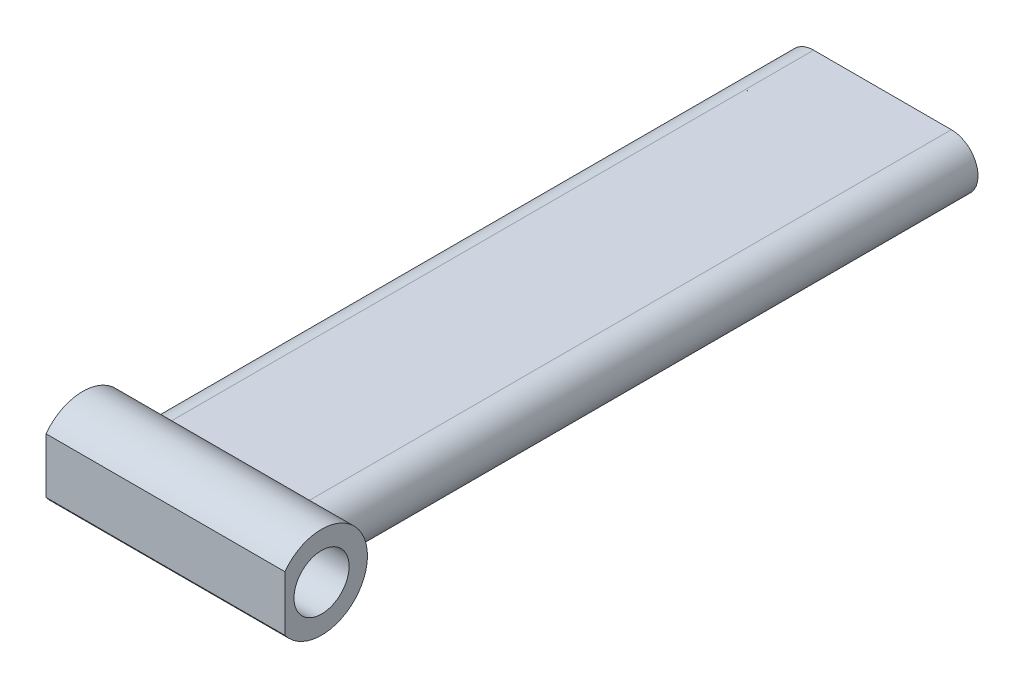
ISO-10303-21;
HEADER;
FILE_DESCRIPTION(('STEP AP214'),'2;1');
FILE_NAME('part.step','',(''),(''),'','','');
FILE_SCHEMA(('AUTOMOTIVE_DESIGN { 1 0 10303 214 1 1 1 1 }'));
ENDSEC;
DATA;
#1=APPLICATION_CONTEXT('core data for automotive mechanical design processes');
#2=APPLICATION_PROTOCOL_DEFINITION('international standard','automotive_design',2000,#1);
#3=PRODUCT_CONTEXT('',#1,'mechanical');
#4=PRODUCT('Part','Part','',(#3));
#5=PRODUCT_RELATED_PRODUCT_CATEGORY('part','',(#4));
#6=PRODUCT_DEFINITION_FORMATION('','',#4);
#7=PRODUCT_DEFINITION_CONTEXT('part definition',#1,'design');
#8=PRODUCT_DEFINITION('design','',#6,#7);
#9=PRODUCT_DEFINITION_SHAPE('','',#8);
#10=(LENGTH_UNIT() NAMED_UNIT(*) SI_UNIT(.MILLI.,.METRE.));
#11=(NAMED_UNIT(*) PLANE_ANGLE_UNIT() SI_UNIT($,.RADIAN.));
#12=(NAMED_UNIT(*) SI_UNIT($,.STERADIAN.) SOLID_ANGLE_UNIT());
#13=UNCERTAINTY_MEASURE_WITH_UNIT(LENGTH_MEASURE(1.E-05),#10,'distance_accuracy_value','');
#14=(GEOMETRIC_REPRESENTATION_CONTEXT(3) GLOBAL_UNCERTAINTY_ASSIGNED_CONTEXT((#13)) GLOBAL_UNIT_ASSIGNED_CONTEXT((#10,
#11,#12)) REPRESENTATION_CONTEXT('',''));
#15=CARTESIAN_POINT('',(0.,0.,0.));
#16=DIRECTION('',(0.,0.,1.));
#17=DIRECTION('',(1.,0.,0.));
#18=AXIS2_PLACEMENT_3D('',#15,#16,#17);
#19=CARTESIAN_POINT('',(7.5,0.,35.));
#20=DIRECTION('',(0.,0.,1.));
#21=DIRECTION('',(1.,0.,0.));
#22=AXIS2_PLACEMENT_3D('',#19,#20,#21);
#23=PLANE('',#22);
#24=CARTESIAN_POINT('',(7.5,0.,35.));
#25=DIRECTION('',(0.,0.,1.));
#26=DIRECTION('',(1.,0.,0.));
#27=AXIS2_PLACEMENT_3D('',#24,#25,#26);
#28=CIRCLE('',#27,2.9);
#29=CARTESIAN_POINT('',(7.5,-2.9,35.));
#30=VERTEX_POINT('',#29);
#31=CARTESIAN_POINT('',(7.79725742015153,-2.88472494809555,35.));
#32=VERTEX_POINT('',#31);
#33=EDGE_CURVE('E251',#30,#32,#28,.T.);
#34=ORIENTED_EDGE('',*,*,#33,.T.);
#35=DIRECTION('',(-1.,0.,0.));
#36=VECTOR('',#35,1.);
#37=CARTESIAN_POINT('',(13.,-2.88472494809555,35.));
#38=LINE('',#37,#36);
#39=CARTESIAN_POINT('',(-7.79725742015153,-2.88472494809555,35.));
#40=VERTEX_POINT('',#39);
#41=EDGE_CURVE('E234',#32,#40,#38,.T.);
#42=ORIENTED_EDGE('',*,*,#41,.T.);
#43=CARTESIAN_POINT('',(-7.5,0.,35.));
#44=DIRECTION('',(0.,0.,1.));
#45=DIRECTION('',(1.,0.,0.));
#46=AXIS2_PLACEMENT_3D('',#43,#44,#45);
#47=CIRCLE('',#46,2.9);
#48=CARTESIAN_POINT('',(-7.5,-2.9,35.));
#49=VERTEX_POINT('',#48);
#50=EDGE_CURVE('E253',#40,#49,#47,.T.);
#51=ORIENTED_EDGE('',*,*,#50,.T.);
#52=DIRECTION('',(1.,0.,0.));
#53=VECTOR('',#52,1.);
#54=CARTESIAN_POINT('',(7.5,-2.9,35.));
#55=LINE('',#54,#53);
#56=EDGE_CURVE('E256',#49,#30,#55,.T.);
#57=ORIENTED_EDGE('',*,*,#56,.T.);
#58=EDGE_LOOP('',(#34,#42,#51,#57));
#59=FACE_BOUND('',#58,.T.);
#60=ADVANCED_FACE('F43',(#59),#23,.T.);
#61=CARTESIAN_POINT('',(7.5,0.,35.));
#62=DIRECTION('',(0.,0.,-1.));
#63=DIRECTION('',(-1.,0.,0.));
#64=AXIS2_PLACEMENT_3D('',#61,#62,#63);
#65=CYLINDRICAL_SURFACE('',#64,2.9);
#66=CARTESIAN_POINT('',(7.79725742015153,-2.88472494809555,35.));
#67=CARTESIAN_POINT('',(7.87444656230203,-2.87678481563113,34.9943629773971));
#68=CARTESIAN_POINT('',(7.95111856073107,-2.86574015093337,34.9865177861138));
#69=CARTESIAN_POINT('',(8.10276534300588,-2.83770869846666,34.9668906475815));
#70=CARTESIAN_POINT('',(8.17774203182165,-2.82072897327608,34.9551133801514));
#71=CARTESIAN_POINT('',(8.32501411458743,-2.78121034727728,34.9281787931683));
#72=CARTESIAN_POINT('',(8.39732437538678,-2.758710386869,34.9130452183058));
#73=CARTESIAN_POINT('',(8.53939058315441,-2.70838529291793,34.8799230786297));
#74=CARTESIAN_POINT('',(8.60914579229032,-2.68055863538374,34.8619336970093));
#75=CARTESIAN_POINT('',(8.81343064030587,-2.58979078954068,34.804743085288));
#76=CARTESIAN_POINT('',(8.9437641935257,-2.51934705363182,34.7621648155252));
#77=CARTESIAN_POINT('',(9.19137058603209,-2.36029742074441,34.6725138746928));
#78=CARTESIAN_POINT('',(9.30861316897932,-2.27165074109023,34.6254312406075));
#79=CARTESIAN_POINT('',(9.5420354566749,-2.06572576869193,34.5251014440436));
#80=CARTESIAN_POINT('',(9.65627762993367,-1.94625952396987,34.4718143738469));
#81=CARTESIAN_POINT('',(9.86370446987784,-1.68826408186293,34.3701988898158));
#82=CARTESIAN_POINT('',(9.95689335857123,-1.54973871555968,34.3218694828391));
#83=CARTESIAN_POINT('',(10.0790958718125,-1.32872801209333,34.2564737346911));
#84=CARTESIAN_POINT('',(10.117127621727,-1.25219840393285,34.2357238449381));
#85=CARTESIAN_POINT('',(10.1865136140957,-1.09543650182371,34.1973447851959));
#86=CARTESIAN_POINT('',(10.2178712625068,-1.01520612202767,34.1797140242184));
#87=CARTESIAN_POINT('',(10.2734646866107,-0.85167081898371,34.1481122299118));
#88=CARTESIAN_POINT('',(10.2977054454134,-0.768368093156578,34.1341386366518));
#89=CARTESIAN_POINT('',(10.3387114746555,-0.599405389093281,34.1102741822263));
#90=CARTESIAN_POINT('',(10.3554780398454,-0.513745821863262,34.1003826139559));
#91=CARTESIAN_POINT('',(10.3907918462767,-0.276529933863106,34.0793231308329));
#92=CARTESIAN_POINT('',(10.4014146492948,-0.123278091942405,34.0726625978854));
#93=CARTESIAN_POINT('',(10.3982797409959,0.182817673991797,34.0735441645788));
#94=CARTESIAN_POINT('',(10.3845303043701,0.335661718813764,34.0810814439328));
#95=CARTESIAN_POINT('',(10.3353844930269,0.62491029574076,34.1084182588661));
#96=CARTESIAN_POINT('',(10.3016619548313,0.761695243729929,34.1272709937785));
#97=CARTESIAN_POINT('',(10.2155050354062,1.02740184874574,34.1747324076693));
#98=CARTESIAN_POINT('',(10.1630683275601,1.15632252572182,34.2033422996749));
#99=CARTESIAN_POINT('',(10.0375510282051,1.4114842901782,34.2700569898591));
#100=CARTESIAN_POINT('',(9.96339613397827,1.53706900321989,34.3086387914648));
#101=CARTESIAN_POINT('',(9.79817019390006,1.77465051168237,34.3911548301832));
#102=CARTESIAN_POINT('',(9.70708642932143,1.88663698540931,34.435093083022));
#103=CARTESIAN_POINT('',(9.49710626789716,2.10899924394007,34.5307501033468));
#104=CARTESIAN_POINT('',(9.37613810335334,2.21730606130715,34.5827416577964));
#105=CARTESIAN_POINT('',(9.11705381920123,2.41277063226341,34.6839886901025));
#106=CARTESIAN_POINT('',(8.97893443164825,2.49992434602571,34.7332436439392));
#107=CARTESIAN_POINT('',(8.70509124365897,2.64170817477487,34.8177514467114));
#108=CARTESIAN_POINT('',(8.57103466866237,2.69897301747579,34.8539727760175));
#109=CARTESIAN_POINT('',(8.29372835453502,2.7930811911057,34.9153206703146));
#110=CARTESIAN_POINT('',(8.15050491012145,2.82998024754553,34.9404774716688));
#111=CARTESIAN_POINT('',(7.92172906608497,2.87040610738242,34.9683851505163));
#112=CARTESIAN_POINT('',(7.83804897175265,2.88146473716867,34.9761210853675));
#113=CARTESIAN_POINT('',(7.66960163732556,2.8962762525586,34.98653604961));
#114=CARTESIAN_POINT('',(7.58483287018471,2.90001740422678,34.9892069567722));
#115=CARTESIAN_POINT('',(7.5,2.9,34.9891673406904));
#116=B_SPLINE_CURVE_WITH_KNOTS('',3,(#66,#67,#68,#69,#70,#71,#72,#73,#74,#75,#76,#77,#78,#79,
#80,#81,#82,#83,#84,#85,#86,#87,#88,#89,#90,#91,#92,#93,#94,#95,#96,#97,#98,#99,#100,#101,#102,
#103,#104,#105,#106,#107,#108,#109,#110,#111,#112,#113,#114,#115),.UNSPECIFIED.,.F.,.F.,(4,2,2,
2,2,2,2,2,2,2,2,2,2,2,2,2,2,2,2,2,2,2,2,2,4),(0.,0.233255654825925,0.466234680754826,
0.697615253516331,0.929062124483841,1.38950148714879,1.85098391974783,2.36973628491922,
2.88838452740143,3.1518874366328,3.4152555497535,3.67843881535998,3.94157647213564,
4.40012887124407,4.85852561568472,5.2830654402932,5.70765806369863,6.15845392016747,
6.60958984054299,7.11888710936857,7.62828156755885,8.0771184279884,8.52472100002464,
8.7785720619935,9.03282985396013),.UNSPECIFIED.);
#117=CARTESIAN_POINT('',(7.5,2.9,34.9891673406904));
#118=VERTEX_POINT('',#117);
#119=EDGE_CURVE('E66',#32,#118,#116,.T.);
#120=ORIENTED_EDGE('',*,*,#119,.F.);
#121=ORIENTED_EDGE('',*,*,#33,.F.);
#122=DIRECTION('',(0.,0.,-1.));
#123=VECTOR('',#122,1.);
#124=CARTESIAN_POINT('',(7.5,-2.9,35.));
#125=LINE('',#124,#123);
#126=CARTESIAN_POINT('',(7.5,-2.9,-35.));
#127=VERTEX_POINT('',#126);
#128=EDGE_CURVE('E258',#30,#127,#125,.T.);
#129=ORIENTED_EDGE('',*,*,#128,.T.);
#130=CARTESIAN_POINT('',(7.5,0.,-35.));
#131=DIRECTION('',(0.,0.,1.));
#132=DIRECTION('',(1.,0.,0.));
#133=AXIS2_PLACEMENT_3D('',#130,#131,#132);
#134=CIRCLE('',#133,2.9);
#135=CARTESIAN_POINT('',(7.5,2.9,-35.));
#136=VERTEX_POINT('',#135);
#137=EDGE_CURVE('E221',#127,#136,#134,.T.);
#138=ORIENTED_EDGE('',*,*,#137,.T.);
#139=DIRECTION('',(0.,0.,-1.));
#140=VECTOR('',#139,1.);
#141=CARTESIAN_POINT('',(7.5,2.9,35.));
#142=LINE('',#141,#140);
#143=EDGE_CURVE('E273',#118,#136,#142,.T.);
#144=ORIENTED_EDGE('',*,*,#143,.F.);
#145=EDGE_LOOP('',(#120,#121,#129,#138,#144));
#146=FACE_BOUND('',#145,.T.);
#147=ADVANCED_FACE('F45',(#146),#65,.T.);
#148=CARTESIAN_POINT('',(7.5,2.9,35.));
#149=DIRECTION('',(0.,-1.,0.));
#150=DIRECTION('',(1.,0.,0.));
#151=AXIS2_PLACEMENT_3D('',#148,#149,#150);
#152=PLANE('',#151);
#153=DIRECTION('',(-1.,0.,0.));
#154=VECTOR('',#153,1.);
#155=CARTESIAN_POINT('',(13.,2.9,34.9891673406904));
#156=LINE('',#155,#154);
#157=CARTESIAN_POINT('',(-7.5,2.9,34.9891673406904));
#158=VERTEX_POINT('',#157);
#159=EDGE_CURVE('E187',#118,#158,#156,.T.);
#160=ORIENTED_EDGE('',*,*,#159,.F.);
#161=ORIENTED_EDGE('',*,*,#143,.T.);
#162=DIRECTION('',(-1.,0.,0.));
#163=VECTOR('',#162,1.);
#164=CARTESIAN_POINT('',(7.5,2.9,-35.));
#165=LINE('',#164,#163);
#166=CARTESIAN_POINT('',(-7.5,2.9,-35.));
#167=VERTEX_POINT('',#166);
#168=EDGE_CURVE('E260',#136,#167,#165,.T.);
#169=ORIENTED_EDGE('',*,*,#168,.T.);
#170=DIRECTION('',(0.,0.,-1.));
#171=VECTOR('',#170,1.);
#172=CARTESIAN_POINT('',(-7.5,2.9,35.));
#173=LINE('',#172,#171);
#174=EDGE_CURVE('E271',#158,#167,#173,.T.);
#175=ORIENTED_EDGE('',*,*,#174,.F.);
#176=EDGE_LOOP('',(#160,#161,#169,#175));
#177=FACE_BOUND('',#176,.T.);
#178=ADVANCED_FACE('F193',(#177),#152,.F.);
#179=CARTESIAN_POINT('',(-7.5,0.,35.));
#180=DIRECTION('',(0.,0.,-1.));
#181=DIRECTION('',(-1.,0.,0.));
#182=AXIS2_PLACEMENT_3D('',#179,#180,#181);
#183=CYLINDRICAL_SURFACE('',#182,2.9);
#184=CARTESIAN_POINT('',(-7.5,2.9,34.9891673406904));
#185=CARTESIAN_POINT('',(-7.57400704934602,2.90001569165979,34.989196195973));
#186=CARTESIAN_POINT('',(-7.64799742650646,2.89716766795981,34.9871670039387));
#187=CARTESIAN_POINT('',(-7.79527508448845,2.885868690905,34.9792115659215));
#188=CARTESIAN_POINT('',(-7.86856292549288,2.87742265816203,34.9732887424512));
#189=CARTESIAN_POINT('',(-8.01335739012298,2.85513495326292,34.9578221003952));
#190=CARTESIAN_POINT('',(-8.08487320714157,2.84133387525258,34.9483055384896));
#191=CARTESIAN_POINT('',(-8.22618071505729,2.8085455584468,34.926031237379));
#192=CARTESIAN_POINT('',(-8.29597209732147,2.78955739851391,34.9132729225222));
#193=CARTESIAN_POINT('',(-8.50165327274928,2.72529685470534,34.870890335768));
#194=CARTESIAN_POINT('',(-8.63445059564298,2.67263339588107,34.8370880380618));
#195=CARTESIAN_POINT('',(-8.88942569550623,2.54943983214673,34.7622593079368));
#196=CARTESIAN_POINT('',(-9.01158048916934,2.47887228700648,34.7212177926893));
#197=CARTESIAN_POINT('',(-9.2566071663004,2.31270245739687,34.6310433964661));
#198=CARTESIAN_POINT('',(-9.37804131358033,2.21518645208368,34.5815185279501));
#199=CARTESIAN_POINT('',(-9.60396003963363,2.00188187200874,34.4831779837228));
#200=CARTESIAN_POINT('',(-9.70843891148425,1.88608717064168,34.434362551811));
#201=CARTESIAN_POINT('',(-9.90755329892538,1.62572536188213,34.3373178143209));
#202=CARTESIAN_POINT('',(-10.0002625646777,1.47945929347886,34.289600796379));
#203=CARTESIAN_POINT('',(-10.1193284751632,1.24767600279135,34.2266765012167));
#204=CARTESIAN_POINT('',(-10.15569300054,1.16832202341342,34.2071384800816));
#205=CARTESIAN_POINT('',(-10.2213233331203,1.0060043935812,34.1715177182351));
#206=CARTESIAN_POINT('',(-10.2505936712109,0.923043087189366,34.155432772881));
#207=CARTESIAN_POINT('',(-10.2992952463046,0.761829585791332,34.1285174247393));
#208=CARTESIAN_POINT('',(-10.3193771204752,0.683830530989968,34.1173432617407));
#209=CARTESIAN_POINT('',(-10.3530285319048,0.526051330281843,34.09860614451));
#210=CARTESIAN_POINT('',(-10.3666015887238,0.446272171424762,34.0910412386292));
#211=CARTESIAN_POINT('',(-10.3870350154714,0.28561978373764,34.0797478399456));
#212=CARTESIAN_POINT('',(-10.3938984675538,0.204747074571443,34.0760175855996));
#213=CARTESIAN_POINT('',(-10.4008227120792,0.042652295453344,34.0724986129907));
#214=CARTESIAN_POINT('',(-10.4008841163622,-0.0385697424194121,34.0727095402189));
#215=CARTESIAN_POINT('',(-10.3916024476161,-0.262982391649833,34.0787810621019));
#216=CARTESIAN_POINT('',(-10.3749982927931,-0.405843444860315,34.0888574391538));
#217=CARTESIAN_POINT('',(-10.3212644188251,-0.68621476252318,34.1205195625913));
#218=CARTESIAN_POINT('',(-10.2841331383955,-0.823724619114156,34.1421061844366));
#219=CARTESIAN_POINT('',(-10.1905472777268,-1.09144537817059,34.1951761051099));
#220=CARTESIAN_POINT('',(-10.133912273134,-1.22157442162895,34.2267515781753));
#221=CARTESIAN_POINT('',(-10.0033923760182,-1.47065531527116,34.2972268236443));
#222=CARTESIAN_POINT('',(-9.9295032027474,-1.58960438142215,34.3361284131882));
#223=CARTESIAN_POINT('',(-9.75687287041819,-1.82772459472388,34.4232200405303));
#224=CARTESIAN_POINT('',(-9.65624441545031,-1.9453254650374,34.4719640337649));
#225=CARTESIAN_POINT('',(-9.43789298429244,-2.16296361245613,34.570904033935));
#226=CARTESIAN_POINT('',(-9.32014337296378,-2.26297297698387,34.6211022038493));
#227=CARTESIAN_POINT('',(-9.05595657148415,-2.45319093121483,34.7234252205057));
#228=CARTESIAN_POINT('',(-8.90780389781814,-2.54125620182282,34.775195676382));
#229=CARTESIAN_POINT('',(-8.67392049318451,-2.65318163818054,34.844456987186));
#230=CARTESIAN_POINT('',(-8.59410436031471,-2.68710366516788,34.8661271746747));
#231=CARTESIAN_POINT('',(-8.43096765139929,-2.74788330471616,34.9057970339737));
#232=CARTESIAN_POINT('',(-8.34764959592986,-2.77474590075651,34.9237992930645));
#233=CARTESIAN_POINT('',(-8.18722444378008,-2.81848678723504,34.9535642653628));
#234=CARTESIAN_POINT('',(-8.11041107918988,-2.83612744300558,34.965789400296));
#235=CARTESIAN_POINT('',(-7.95500248100824,-2.86517889831741,34.9861199381393));
#236=CARTESIAN_POINT('',(-7.87640549382443,-2.87658326332353,34.994221085372));
#237=CARTESIAN_POINT('',(-7.79725742015153,-2.88472494809555,35.));
#238=B_SPLINE_CURVE_WITH_KNOTS('',3,(#184,#185,#186,#187,#188,#189,#190,#191,#192,#193,#194,
#195,#196,#197,#198,#199,#200,#201,#202,#203,#204,#205,#206,#207,#208,#209,#210,#211,#212,#213,
#214,#215,#216,#217,#218,#219,#220,#221,#222,#223,#224,#225,#226,#227,#228,#229,#230,#231,#232,
#233,#234,#235,#236,#237),.UNSPECIFIED.,.F.,.F.,(4,2,2,2,2,2,2,2,2,2,2,2,2,2,2,2,2,2,2,2,2,2,2,
2,2,2,4),(0.,0.221911481404682,0.443628162353622,0.663695951038849,0.883802845450553,
1.32220377904,1.76152914402411,2.24982326359511,2.73828139718764,3.27393159307859,
3.54193750891672,3.80977180206495,4.05337122537894,4.2968387764557,4.54019443456728,
4.78352820296964,5.2137993167418,5.64410316125523,6.07849960973393,6.5130039463997,
6.99783866511144,7.48343586830394,8.02020396823574,8.28804175291308,8.55568995127358,
8.79459879695868,9.03375368323187),.UNSPECIFIED.);
#239=EDGE_CURVE('E179',#158,#40,#238,.T.);
#240=ORIENTED_EDGE('',*,*,#239,.F.);
#241=ORIENTED_EDGE('',*,*,#174,.T.);
#242=CARTESIAN_POINT('',(-7.5,0.,-35.));
#243=DIRECTION('',(0.,0.,1.));
#244=DIRECTION('',(1.,0.,0.));
#245=AXIS2_PLACEMENT_3D('',#242,#243,#244);
#246=CIRCLE('',#245,2.9);
#247=CARTESIAN_POINT('',(-7.5,-2.9,-35.));
#248=VERTEX_POINT('',#247);
#249=EDGE_CURVE('E263',#167,#248,#246,.T.);
#250=ORIENTED_EDGE('',*,*,#249,.T.);
#251=DIRECTION('',(0.,0.,-1.));
#252=VECTOR('',#251,1.);
#253=CARTESIAN_POINT('',(-7.5,-2.9,35.));
#254=LINE('',#253,#252);
#255=EDGE_CURVE('E268',#49,#248,#254,.T.);
#256=ORIENTED_EDGE('',*,*,#255,.F.);
#257=ORIENTED_EDGE('',*,*,#50,.F.);
#258=EDGE_LOOP('',(#240,#241,#250,#256,#257));
#259=FACE_BOUND('',#258,.T.);
#260=ADVANCED_FACE('F188',(#259),#183,.T.);
#261=CARTESIAN_POINT('',(7.5,0.,35.));
#262=DIRECTION('',(0.,0.,-1.));
#263=DIRECTION('',(-1.,0.,0.));
#264=AXIS2_PLACEMENT_3D('',#261,#262,#263);
#265=CYLINDRICAL_SURFACE('',#264,1.9);
#266=DIRECTION('',(0.,0.,-1.));
#267=VECTOR('',#266,1.);
#268=CARTESIAN_POINT('',(7.5,-1.9,35.));
#269=LINE('',#268,#267);
#270=CARTESIAN_POINT('',(7.5,-1.9,34.4544547093855));
#271=VERTEX_POINT('',#270);
#272=CARTESIAN_POINT('',(7.5,-1.9,-35.));
#273=VERTEX_POINT('',#272);
#274=EDGE_CURVE('E243',#271,#273,#269,.T.);
#275=ORIENTED_EDGE('',*,*,#274,.F.);
#276=CARTESIAN_POINT('',(7.5,-1.9,34.4544547093855));
#277=CARTESIAN_POINT('',(7.55132104191155,-1.90000199282073,34.4544609497436));
#278=CARTESIAN_POINT('',(7.60261525499819,-1.89791930034499,34.4535913490001));
#279=CARTESIAN_POINT('',(7.704794463836,-1.88962598184188,34.4501631208616));
#280=CARTESIAN_POINT('',(7.75567959601062,-1.88341679510571,34.4476050823834));
#281=CARTESIAN_POINT('',(7.90678436024451,-1.85873419587925,34.4375218388795));
#282=CARTESIAN_POINT('',(8.00592438062338,-1.83420485736052,34.4275863663713));
#283=CARTESIAN_POINT('',(8.19825624581104,-1.76995232389171,34.4025221826307));
#284=CARTESIAN_POINT('',(8.29145335523397,-1.73024280099031,34.3873981457378));
#285=CARTESIAN_POINT('',(8.46996243098135,-1.63686492430712,34.353665784976));
#286=CARTESIAN_POINT('',(8.55526755578093,-1.58318461019439,34.3350544795143));
#287=CARTESIAN_POINT('',(8.71989533400124,-1.46044087497664,34.2953626680612));
#288=CARTESIAN_POINT('',(8.79875021354351,-1.3907743891213,34.27420731707));
#289=CARTESIAN_POINT('',(8.94398970596972,-1.23931643350258,34.2324040184465));
#290=CARTESIAN_POINT('',(9.01037182267591,-1.15752254252553,34.2117561730987));
#291=CARTESIAN_POINT('',(9.13111600227125,-0.98048315408637,34.1723711172086));
#292=CARTESIAN_POINT('',(9.18495475304934,-0.88485735963562,34.1537303715881));
#293=CARTESIAN_POINT('',(9.27558199550247,-0.685074301502219,34.1213423262195));
#294=CARTESIAN_POINT('',(9.31237693775437,-0.580920283091454,34.1075931756052));
#295=CARTESIAN_POINT('',(9.36623443659156,-0.371887099046852,34.0870374914928));
#296=CARTESIAN_POINT('',(9.38409323717472,-0.26724103502006,34.0799523604611));
#297=CARTESIAN_POINT('',(9.40211577873216,-0.0562111153156348,34.0724802249334));
#298=CARTESIAN_POINT('',(9.40228524397592,0.050172167052533,34.0720910536586));
#299=CARTESIAN_POINT('',(9.38537911099875,0.255814306799695,34.0778662673397));
#300=CARTESIAN_POINT('',(9.36919273035615,0.355157572109709,34.0836935917113));
#301=CARTESIAN_POINT('',(9.32152582889796,0.549605665823809,34.1007568699965));
#302=CARTESIAN_POINT('',(9.29004450148539,0.644710270408336,34.1119931091553));
#303=CARTESIAN_POINT('',(9.21232425253843,0.8295404115418,34.1389338646569));
#304=CARTESIAN_POINT('',(9.16588934566406,0.9191745683888,34.1546974021419));
#305=CARTESIAN_POINT('',(9.05975665294317,1.08960812178356,34.1890902889425));
#306=CARTESIAN_POINT('',(9.00005453277761,1.17040461821904,34.2077205741943));
#307=CARTESIAN_POINT('',(8.86494466473912,1.32595568552592,34.2472212377292));
#308=CARTESIAN_POINT('',(8.7888150548413,1.4000670159151,34.2681589418945));
#309=CARTESIAN_POINT('',(8.62509051522641,1.53473449363842,34.3090286441198));
#310=CARTESIAN_POINT('',(8.537490988105,1.59528517903795,34.3289602344443));
#311=CARTESIAN_POINT('',(8.35063040201182,1.70244196792297,34.3659846655564));
#312=CARTESIAN_POINT('',(8.25113788250836,1.74867389222105,34.3829968519824));
#313=CARTESIAN_POINT('',(8.04502249205741,1.82343590711964,34.4113041804566));
#314=CARTESIAN_POINT('',(7.93841190282355,1.85199565782827,34.4226088957401));
#315=CARTESIAN_POINT('',(7.77560008226539,1.88072037840287,34.4340943732594));
#316=CARTESIAN_POINT('',(7.72075012247916,1.88794300068252,34.4370112115444));
#317=CARTESIAN_POINT('',(7.61061095529855,1.89758204083242,34.4409194351059));
#318=CARTESIAN_POINT('',(7.5553221781959,1.90000269400074,34.4419125171018));
#319=CARTESIAN_POINT('',(7.5,1.9,34.4419041331098));
#320=B_SPLINE_CURVE_WITH_KNOTS('',3,(#276,#277,#278,#279,#280,#281,#282,#283,#284,#285,#286,
#287,#288,#289,#290,#291,#292,#293,#294,#295,#296,#297,#298,#299,#300,#301,#302,#303,#304,#305,
#306,#307,#308,#309,#310,#311,#312,#313,#314,#315,#316,#317,#318,#319),.UNSPECIFIED.,.F.,.F.,(4,
2,2,2,2,2,2,2,2,2,2,2,2,2,2,2,2,2,2,2,2,4),(0.,0.153861482569741,0.307669327518225,
0.613891131926319,0.919837784667402,1.2260472234725,1.54660820386233,1.86723327004328,
2.19948775452412,2.53161638756914,2.84914637981525,3.1665736190271,3.46762486452651,
3.76869198804068,4.07387755692456,4.37916297506226,4.70256811393492,5.026103280067,
5.3574921362424,5.68832328625011,5.85430994153924,6.0201501327297),.UNSPECIFIED.);
#321=CARTESIAN_POINT('',(7.5,1.9,34.4419041331098));
#322=VERTEX_POINT('',#321);
#323=EDGE_CURVE('E172',#271,#322,#320,.T.);
#324=ORIENTED_EDGE('',*,*,#323,.T.);
#325=DIRECTION('',(0.,0.,-1.));
#326=VECTOR('',#325,1.);
#327=CARTESIAN_POINT('',(7.5,1.9,35.));
#328=LINE('',#327,#326);
#329=CARTESIAN_POINT('',(7.5,1.9,-35.));
#330=VERTEX_POINT('',#329);
#331=EDGE_CURVE('E249',#322,#330,#328,.T.);
#332=ORIENTED_EDGE('',*,*,#331,.T.);
#333=CARTESIAN_POINT('',(7.5,0.,-35.));
#334=DIRECTION('',(0.,0.,1.));
#335=DIRECTION('',(1.,0.,0.));
#336=AXIS2_PLACEMENT_3D('',#333,#334,#335);
#337=CIRCLE('',#336,1.9);
#338=EDGE_CURVE('E226',#273,#330,#337,.T.);
#339=ORIENTED_EDGE('',*,*,#338,.F.);
#340=EDGE_LOOP('',(#275,#324,#332,#339));
#341=FACE_BOUND('',#340,.T.);
#342=ADVANCED_FACE('F192',(#341),#265,.F.);
#343=CARTESIAN_POINT('',(7.5,1.9,35.));
#344=DIRECTION('',(0.,-1.,0.));
#345=DIRECTION('',(0.,0.,-1.));
#346=AXIS2_PLACEMENT_3D('',#343,#344,#345);
#347=PLANE('',#346);
#348=ORIENTED_EDGE('',*,*,#331,.F.);
#349=DIRECTION('',(-1.,0.,0.));
#350=VECTOR('',#349,1.);
#351=CARTESIAN_POINT('',(13.,1.9,34.4419041331098));
#352=LINE('',#351,#350);
#353=CARTESIAN_POINT('',(-7.5,1.9,34.4419041331098));
#354=VERTEX_POINT('',#353);
#355=EDGE_CURVE('E154',#322,#354,#352,.T.);
#356=ORIENTED_EDGE('',*,*,#355,.T.);
#357=DIRECTION('',(0.,0.,-1.));
#358=VECTOR('',#357,1.);
#359=CARTESIAN_POINT('',(-7.5,1.9,35.));
#360=LINE('',#359,#358);
#361=CARTESIAN_POINT('',(-7.5,1.9,-35.));
#362=VERTEX_POINT('',#361);
#363=EDGE_CURVE('E247',#354,#362,#360,.T.);
#364=ORIENTED_EDGE('',*,*,#363,.T.);
#365=DIRECTION('',(-1.,0.,0.));
#366=VECTOR('',#365,1.);
#367=CARTESIAN_POINT('',(7.5,1.9,-35.));
#368=LINE('',#367,#366);
#369=EDGE_CURVE('E229',#330,#362,#368,.T.);
#370=ORIENTED_EDGE('',*,*,#369,.F.);
#371=EDGE_LOOP('',(#348,#356,#364,#370));
#372=FACE_BOUND('',#371,.T.);
#373=ADVANCED_FACE('F280',(#372),#347,.T.);
#374=CARTESIAN_POINT('',(-7.5,0.,35.));
#375=DIRECTION('',(0.,0.,-1.));
#376=DIRECTION('',(-1.,0.,0.));
#377=AXIS2_PLACEMENT_3D('',#374,#375,#376);
#378=CYLINDRICAL_SURFACE('',#377,1.9);
#379=ORIENTED_EDGE('',*,*,#363,.F.);
#380=CARTESIAN_POINT('',(-7.5,1.9,34.4419041331098));
#381=CARTESIAN_POINT('',(-7.55140120057559,1.90000192295894,34.4419103170547));
#382=CARTESIAN_POINT('',(-7.60277560023468,1.89791279834026,34.441054189624));
#383=CARTESIAN_POINT('',(-7.70511581418116,1.88959335699848,34.4376793418519));
#384=CARTESIAN_POINT('',(-7.75608176150567,1.88336444915396,34.4351611871447));
#385=CARTESIAN_POINT('',(-7.90743717212791,1.85860087405696,34.4252352844799));
#386=CARTESIAN_POINT('',(-8.00674735166341,1.83398849544365,34.4154549919449));
#387=CARTESIAN_POINT('',(-8.19941723534728,1.76950522018562,34.3907914429022));
#388=CARTESIAN_POINT('',(-8.2927819848967,1.72964746788731,34.3759125834544));
#389=CARTESIAN_POINT('',(-8.47160147067214,1.63590613097937,34.3427524008027));
#390=CARTESIAN_POINT('',(-8.55704954599121,1.58201087825288,34.3244682507055));
#391=CARTESIAN_POINT('',(-8.72181229613022,1.45884587293904,34.2855515014059));
#392=CARTESIAN_POINT('',(-8.80067121069311,1.38898831411066,34.2648499107903));
#393=CARTESIAN_POINT('',(-8.94587740390131,1.23712491818622,34.2240350868386));
#394=CARTESIAN_POINT('',(-9.01222228847178,1.15511676189139,34.203921966704));
#395=CARTESIAN_POINT('',(-9.13269377879347,0.977842520718162,34.1657462709503));
#396=CARTESIAN_POINT('',(-9.18632923836708,0.882220913440476,34.1477764664444));
#397=CARTESIAN_POINT('',(-9.27656201838773,0.682510422206219,34.1167746434939));
#398=CARTESIAN_POINT('',(-9.31316589053944,0.578424812310224,34.1037407266735));
#399=CARTESIAN_POINT('',(-9.36666917366946,0.369645763464883,34.0846040277735));
#400=CARTESIAN_POINT('',(-9.38437090593972,0.265184264508328,34.0782193372925));
#401=CARTESIAN_POINT('',(-9.40215043738164,0.0545908466835845,34.0721288343463));
#402=CARTESIAN_POINT('',(-9.40223369820672,-0.0515405443220569,34.072420952067));
#403=CARTESIAN_POINT('',(-9.38523787227887,-0.256819863520474,34.0794871501014));
#404=CARTESIAN_POINT('',(-9.36901620024334,-0.356051740923057,34.0859365896925));
#405=CARTESIAN_POINT('',(-9.32132476633634,-0.550250389055454,34.1042094752377));
#406=CARTESIAN_POINT('',(-9.28985407719841,-0.645216900031912,34.1160332479931));
#407=CARTESIAN_POINT('',(-9.21212885522906,-0.829950240085922,34.1441404988609));
#408=CARTESIAN_POINT('',(-9.16565020232267,-0.919612161677449,34.1604910120214));
#409=CARTESIAN_POINT('',(-9.05942657517189,-1.090084279118,34.1960162256795));
#410=CARTESIAN_POINT('',(-8.99967715916638,-1.17089149771848,34.2151918710315));
#411=CARTESIAN_POINT('',(-8.86439548121131,-1.32653203241649,34.2557792344639));
#412=CARTESIAN_POINT('',(-8.78812838272016,-1.40071059355778,34.2772560598817));
#413=CARTESIAN_POINT('',(-8.62408678294919,-1.5354804758676,34.3191208911425));
#414=CARTESIAN_POINT('',(-8.53630763846011,-1.59606628773526,34.3395084529527));
#415=CARTESIAN_POINT('',(-8.34911976023104,-1.70320177995233,34.3773236967626));
#416=CARTESIAN_POINT('',(-8.24948709345936,-1.7493901432118,34.3946710243951));
#417=CARTESIAN_POINT('',(-8.04306578612787,-1.82402659654455,34.4235023526026));
#418=CARTESIAN_POINT('',(-7.93628979232719,-1.85250516576557,34.4349964206224));
#419=CARTESIAN_POINT('',(-7.77368423097433,-1.88098878209911,34.4466067372316));
#420=CARTESIAN_POINT('',(-7.71921359867039,-1.88811076278367,34.4495380225023));
#421=CARTESIAN_POINT('',(-7.60983947523392,-1.89761559797188,34.4534652487869));
#422=CARTESIAN_POINT('',(-7.55493640007242,-1.90000255359068,34.4544628645796));
#423=CARTESIAN_POINT('',(-7.5,-1.9,34.4544547093855));
#424=B_SPLINE_CURVE_WITH_KNOTS('',3,(#380,#381,#382,#383,#384,#385,#386,#387,#388,#389,#390,
#391,#392,#393,#394,#395,#396,#397,#398,#399,#400,#401,#402,#403,#404,#405,#406,#407,#408,#409,
#410,#411,#412,#413,#414,#415,#416,#417,#418,#419,#420,#421,#422,#423),.UNSPECIFIED.,.F.,.F.,(4,
2,2,2,2,2,2,2,2,2,2,2,2,2,2,2,2,2,2,2,2,4),(0.,0.154102022674633,0.308151627160351,
0.614880212511036,0.921344934748711,1.22806521115532,1.5487366653956,1.86946940561009,
2.2010884586485,2.53257983891286,2.84936100717677,3.16604397444246,3.46690192255651,
3.76777816762027,4.07337317422261,4.37907061886853,4.70321535220956,5.02749122881995,
5.35934934153704,5.690634723122,5.85546149355598,6.02014544125743),.UNSPECIFIED.);
#425=CARTESIAN_POINT('',(-7.5,-1.9,34.4544547093855));
#426=VERTEX_POINT('',#425);
#427=EDGE_CURVE('E142',#354,#426,#424,.T.);
#428=ORIENTED_EDGE('',*,*,#427,.T.);
#429=DIRECTION('',(0.,0.,-1.));
#430=VECTOR('',#429,1.);
#431=CARTESIAN_POINT('',(-7.5,-1.9,35.));
#432=LINE('',#431,#430);
#433=CARTESIAN_POINT('',(-7.5,-1.9,-35.));
#434=VERTEX_POINT('',#433);
#435=EDGE_CURVE('E245',#426,#434,#432,.T.);
#436=ORIENTED_EDGE('',*,*,#435,.T.);
#437=CARTESIAN_POINT('',(-7.5,0.,-35.));
#438=DIRECTION('',(0.,0.,1.));
#439=DIRECTION('',(1.,0.,0.));
#440=AXIS2_PLACEMENT_3D('',#437,#438,#439);
#441=CIRCLE('',#440,1.9);
#442=EDGE_CURVE('E236',#362,#434,#441,.T.);
#443=ORIENTED_EDGE('',*,*,#442,.F.);
#444=EDGE_LOOP('',(#379,#428,#436,#443));
#445=FACE_BOUND('',#444,.T.);
#446=ADVANCED_FACE('F156',(#445),#378,.F.);
#447=CARTESIAN_POINT('',(7.5,-1.9,35.));
#448=DIRECTION('',(0.,1.,0.));
#449=DIRECTION('',(-1.,0.,0.));
#450=AXIS2_PLACEMENT_3D('',#447,#448,#449);
#451=PLANE('',#450);
#452=ORIENTED_EDGE('',*,*,#435,.F.);
#453=DIRECTION('',(-1.,0.,0.));
#454=VECTOR('',#453,1.);
#455=CARTESIAN_POINT('',(13.,-1.9,34.4544547093855));
#456=LINE('',#455,#454);
#457=EDGE_CURVE('E52',#426,#271,#456,.F.);
#458=ORIENTED_EDGE('',*,*,#457,.T.);
#459=ORIENTED_EDGE('',*,*,#274,.T.);
#460=DIRECTION('',(1.,0.,0.));
#461=VECTOR('',#460,1.);
#462=CARTESIAN_POINT('',(7.5,-1.9,-35.));
#463=LINE('',#462,#461);
#464=EDGE_CURVE('E231',#434,#273,#463,.T.);
#465=ORIENTED_EDGE('',*,*,#464,.F.);
#466=EDGE_LOOP('',(#452,#458,#459,#465));
#467=FACE_BOUND('',#466,.T.);
#468=ADVANCED_FACE('F167',(#467),#451,.T.);
#469=CARTESIAN_POINT('',(7.5,0.,-35.));
#470=DIRECTION('',(0.,0.,1.));
#471=DIRECTION('',(1.,0.,0.));
#472=AXIS2_PLACEMENT_3D('',#469,#470,#471);
#473=PLANE('',#472);
#474=ORIENTED_EDGE('',*,*,#137,.F.);
#475=DIRECTION('',(1.,0.,0.));
#476=VECTOR('',#475,1.);
#477=CARTESIAN_POINT('',(7.5,-2.9,-35.));
#478=LINE('',#477,#476);
#479=EDGE_CURVE('E254',#248,#127,#478,.T.);
#480=ORIENTED_EDGE('',*,*,#479,.F.);
#481=ORIENTED_EDGE('',*,*,#249,.F.);
#482=ORIENTED_EDGE('',*,*,#168,.F.);
#483=EDGE_LOOP('',(#474,#480,#481,#482));
#484=FACE_BOUND('',#483,.T.);
#485=ORIENTED_EDGE('',*,*,#338,.T.);
#486=ORIENTED_EDGE('',*,*,#369,.T.);
#487=ORIENTED_EDGE('',*,*,#442,.T.);
#488=ORIENTED_EDGE('',*,*,#464,.T.);
#489=EDGE_LOOP('',(#485,#486,#487,#488));
#490=FACE_BOUND('',#489,.T.);
#491=ADVANCED_FACE('F208',(#484,#490),#473,.F.);
#492=CARTESIAN_POINT('',(7.5,-2.9,35.));
#493=DIRECTION('',(0.,1.,0.));
#494=DIRECTION('',(-1.,0.,0.));
#495=AXIS2_PLACEMENT_3D('',#492,#493,#494);
#496=PLANE('',#495);
#497=ORIENTED_EDGE('',*,*,#479,.T.);
#498=ORIENTED_EDGE('',*,*,#128,.F.);
#499=ORIENTED_EDGE('',*,*,#56,.F.);
#500=ORIENTED_EDGE('',*,*,#255,.T.);
#501=EDGE_LOOP('',(#497,#498,#499,#500));
#502=FACE_BOUND('',#501,.T.);
#503=ADVANCED_FACE('F164',(#502),#496,.F.);
#504=CARTESIAN_POINT('',(13.,0.0152750519044585,39.0730823708833));
#505=DIRECTION('',(-1.,0.,0.));
#506=DIRECTION('',(0.,0.,1.));
#507=AXIS2_PLACEMENT_3D('',#504,#505,#506);
#508=CYLINDRICAL_SURFACE('',#507,5.);
#509=ORIENTED_EDGE('',*,*,#323,.F.);
#510=ORIENTED_EDGE('',*,*,#457,.F.);
#511=ORIENTED_EDGE('',*,*,#427,.F.);
#512=ORIENTED_EDGE('',*,*,#355,.F.);
#513=EDGE_LOOP('',(#509,#510,#511,#512));
#514=FACE_BOUND('',#513,.T.);
#515=ADVANCED_FACE('F160',(#514),#508,.T.);
#516=ORIENTED_EDGE('',*,*,#41,.F.);
#517=ORIENTED_EDGE('',*,*,#119,.T.);
#518=ORIENTED_EDGE('',*,*,#159,.T.);
#519=ORIENTED_EDGE('',*,*,#239,.T.);
#520=EDGE_LOOP('',(#516,#517,#518,#519));
#521=FACE_BOUND('',#520,.T.);
#522=CARTESIAN_POINT('',(13.,0.0152750519044585,39.0730823708833));
#523=DIRECTION('',(1.,0.,0.));
#524=DIRECTION('',(0.,0.,-1.));
#525=AXIS2_PLACEMENT_3D('',#522,#523,#524);
#526=CIRCLE('',#525,5.);
#527=CARTESIAN_POINT('',(13.,-2.98472494809554,43.0730823708833));
#528=VERTEX_POINT('',#527);
#529=CARTESIAN_POINT('',(13.,3.01527505190446,43.0730823708833));
#530=VERTEX_POINT('',#529);
#531=EDGE_CURVE('E137',#528,#530,#526,.T.);
#532=ORIENTED_EDGE('',*,*,#531,.F.);
#533=DIRECTION('',(-1.,0.,0.));
#534=VECTOR('',#533,1.);
#535=CARTESIAN_POINT('',(13.,-2.98472494809554,43.0730823708833));
#536=LINE('',#535,#534);
#537=CARTESIAN_POINT('',(-13.,-2.98472494809554,43.0730823708833));
#538=VERTEX_POINT('',#537);
#539=EDGE_CURVE('E127',#528,#538,#536,.T.);
#540=ORIENTED_EDGE('',*,*,#539,.T.);
#541=CARTESIAN_POINT('',(-13.,0.0152750519044585,39.0730823708833));
#542=DIRECTION('',(1.,0.,0.));
#543=DIRECTION('',(0.,0.,-1.));
#544=AXIS2_PLACEMENT_3D('',#541,#542,#543);
#545=CIRCLE('',#544,5.);
#546=CARTESIAN_POINT('',(-13.,3.01527505190446,43.0730823708833));
#547=VERTEX_POINT('',#546);
#548=EDGE_CURVE('E135',#538,#547,#545,.T.);
#549=ORIENTED_EDGE('',*,*,#548,.T.);
#550=DIRECTION('',(-1.,0.,0.));
#551=VECTOR('',#550,1.);
#552=CARTESIAN_POINT('',(13.,3.01527505190446,43.0730823708833));
#553=LINE('',#552,#551);
#554=EDGE_CURVE('E59',#547,#530,#553,.F.);
#555=ORIENTED_EDGE('',*,*,#554,.T.);
#556=EDGE_LOOP('',(#532,#540,#549,#555));
#557=FACE_BOUND('',#556,.T.);
#558=ADVANCED_FACE('F134',(#521,#557),#508,.T.);
#559=CARTESIAN_POINT('',(13.,0.0152750519044585,39.0730823708833));
#560=DIRECTION('',(1.,0.,0.));
#561=DIRECTION('',(0.,0.,-1.));
#562=AXIS2_PLACEMENT_3D('',#559,#560,#561);
#563=PLANE('',#562);
#564=CARTESIAN_POINT('',(13.,0.0152750519044585,39.0730823708833));
#565=DIRECTION('',(1.,0.,0.));
#566=DIRECTION('',(0.,0.,-1.));
#567=AXIS2_PLACEMENT_3D('',#564,#565,#566);
#568=CIRCLE('',#567,3.);
#569=CARTESIAN_POINT('',(13.,0.0152750519044585,36.0730823708833));
#570=VERTEX_POINT('',#569);
#571=EDGE_CURVE('E396',#570,#570,#568,.T.);
#572=ORIENTED_EDGE('',*,*,#571,.F.);
#573=EDGE_LOOP('',(#572));
#574=FACE_BOUND('',#573,.T.);
#575=DIRECTION('',(0.,1.,0.));
#576=VECTOR('',#575,1.);
#577=CARTESIAN_POINT('',(13.,0.0152750519044585,43.0730823708833));
#578=LINE('',#577,#576);
#579=EDGE_CURVE('E138',#528,#530,#578,.T.);
#580=ORIENTED_EDGE('',*,*,#579,.F.);
#581=ORIENTED_EDGE('',*,*,#531,.T.);
#582=EDGE_LOOP('',(#580,#581));
#583=FACE_BOUND('',#582,.T.);
#584=ADVANCED_FACE('F325',(#574,#583),#563,.T.);
#585=CARTESIAN_POINT('',(-13.,0.0152750519044585,39.0730823708833));
#586=DIRECTION('',(1.,0.,0.));
#587=DIRECTION('',(0.,0.,-1.));
#588=AXIS2_PLACEMENT_3D('',#585,#586,#587);
#589=PLANE('',#588);
#590=CARTESIAN_POINT('',(-13.,0.0152750519044585,39.0730823708833));
#591=DIRECTION('',(1.,0.,0.));
#592=DIRECTION('',(0.,0.,-1.));
#593=AXIS2_PLACEMENT_3D('',#590,#591,#592);
#594=CIRCLE('',#593,3.);
#595=CARTESIAN_POINT('',(-13.,0.0152750519044585,36.0730823708833));
#596=VERTEX_POINT('',#595);
#597=EDGE_CURVE('E393',#596,#596,#594,.T.);
#598=ORIENTED_EDGE('',*,*,#597,.T.);
#599=EDGE_LOOP('',(#598));
#600=FACE_BOUND('',#599,.T.);
#601=ORIENTED_EDGE('',*,*,#548,.F.);
#602=DIRECTION('',(0.,1.,0.));
#603=VECTOR('',#602,1.);
#604=CARTESIAN_POINT('',(-13.,0.0152750519044585,43.0730823708833));
#605=LINE('',#604,#603);
#606=EDGE_CURVE('E11',#538,#547,#605,.T.);
#607=ORIENTED_EDGE('',*,*,#606,.T.);
#608=EDGE_LOOP('',(#601,#607));
#609=FACE_BOUND('',#608,.T.);
#610=ADVANCED_FACE('F140',(#600,#609),#589,.F.);
#611=CARTESIAN_POINT('',(-22.0619514774107,-13.,43.0730823708833));
#612=DIRECTION('',(0.,0.,-1.));
#613=DIRECTION('',(-1.,0.,0.));
#614=AXIS2_PLACEMENT_3D('',#611,#612,#613);
#615=PLANE('',#614);
#616=ORIENTED_EDGE('',*,*,#579,.T.);
#617=ORIENTED_EDGE('',*,*,#554,.F.);
#618=ORIENTED_EDGE('',*,*,#606,.F.);
#619=ORIENTED_EDGE('',*,*,#539,.F.);
#620=EDGE_LOOP('',(#616,#617,#618,#619));
#621=FACE_BOUND('',#620,.T.);
#622=ADVANCED_FACE('F126',(#621),#615,.F.);
#623=CARTESIAN_POINT('',(-13.,0.0152750519044585,39.0730823708833));
#624=DIRECTION('',(1.,0.,0.));
#625=DIRECTION('',(0.,0.,-1.));
#626=AXIS2_PLACEMENT_3D('',#623,#624,#625);
#627=CYLINDRICAL_SURFACE('',#626,3.);
#628=CARTESIAN_POINT('',(-13.,0.0152750519044585,36.0730823708833));
#629=CARTESIAN_POINT('',(-12.7291666666667,0.0152750519044585,36.0730823708833));
#630=CARTESIAN_POINT('',(-12.4583333333333,0.0152750519044585,36.0730823708833));
#631=CARTESIAN_POINT('',(-11.9166666666667,0.0152750519044585,36.0730823708833));
#632=CARTESIAN_POINT('',(-11.6458333333333,0.0152750519044585,36.0730823708833));
#633=CARTESIAN_POINT('',(-11.1041666666667,0.0152750519044585,36.0730823708833));
#634=CARTESIAN_POINT('',(-10.8333333333333,0.0152750519044585,36.0730823708833));
#635=CARTESIAN_POINT('',(-10.2916666666667,0.0152750519044585,36.0730823708833));
#636=CARTESIAN_POINT('',(-10.0208333333333,0.0152750519044585,36.0730823708833));
#637=CARTESIAN_POINT('',(-9.47916666666667,0.0152750519044585,36.0730823708833));
#638=CARTESIAN_POINT('',(-9.20833333333333,0.0152750519044585,36.0730823708833));
#639=CARTESIAN_POINT('',(-8.66666666666667,0.0152750519044585,36.0730823708833));
#640=CARTESIAN_POINT('',(-8.39583333333333,0.0152750519044585,36.0730823708833));
#641=CARTESIAN_POINT('',(-7.85416666666667,0.0152750519044585,36.0730823708833));
#642=CARTESIAN_POINT('',(-7.58333333333333,0.0152750519044585,36.0730823708833));
#643=CARTESIAN_POINT('',(-7.04166666666667,0.0152750519044585,36.0730823708833));
#644=CARTESIAN_POINT('',(-6.77083333333333,0.0152750519044585,36.0730823708833));
#645=CARTESIAN_POINT('',(-6.22916666666667,0.0152750519044585,36.0730823708833));
#646=CARTESIAN_POINT('',(-5.95833333333333,0.0152750519044585,36.0730823708833));
#647=CARTESIAN_POINT('',(-5.41666666666667,0.0152750519044585,36.0730823708833));
#648=CARTESIAN_POINT('',(-5.14583333333334,0.0152750519044585,36.0730823708833));
#649=CARTESIAN_POINT('',(-4.60416666666667,0.0152750519044585,36.0730823708833));
#650=CARTESIAN_POINT('',(-4.33333333333334,0.0152750519044585,36.0730823708833));
#651=CARTESIAN_POINT('',(-3.79166666666667,0.0152750519044585,36.0730823708833));
#652=CARTESIAN_POINT('',(-3.52083333333333,0.0152750519044585,36.0730823708833));
#653=CARTESIAN_POINT('',(-2.97916666666667,0.0152750519044585,36.0730823708833));
#654=CARTESIAN_POINT('',(-2.70833333333334,0.0152750519044585,36.0730823708833));
#655=CARTESIAN_POINT('',(-2.16666666666667,0.0152750519044585,36.0730823708833));
#656=CARTESIAN_POINT('',(-1.89583333333334,0.0152750519044585,36.0730823708833));
#657=CARTESIAN_POINT('',(-1.35416666666667,0.0152750519044585,36.0730823708833));
#658=CARTESIAN_POINT('',(-1.08333333333334,0.0152750519044585,36.0730823708833));
#659=CARTESIAN_POINT('',(-0.541666666666669,0.0152750519044585,36.0730823708833));
#660=CARTESIAN_POINT('',(-0.270833333333335,0.0152750519044585,36.0730823708833));
#661=CARTESIAN_POINT('',(0.270833333333332,0.0152750519044585,36.0730823708833));
#662=CARTESIAN_POINT('',(0.541666666666665,0.0152750519044585,36.0730823708833));
#663=CARTESIAN_POINT('',(1.08333333333333,0.0152750519044585,36.0730823708833));
#664=CARTESIAN_POINT('',(1.35416666666666,0.0152750519044585,36.0730823708833));
#665=CARTESIAN_POINT('',(1.89583333333333,0.0152750519044585,36.0730823708833));
#666=CARTESIAN_POINT('',(2.16666666666667,0.0152750519044585,36.0730823708833));
#667=CARTESIAN_POINT('',(2.70833333333333,0.0152750519044585,36.0730823708833));
#668=CARTESIAN_POINT('',(2.97916666666666,0.0152750519044585,36.0730823708833));
#669=CARTESIAN_POINT('',(3.52083333333333,0.0152750519044585,36.0730823708833));
#670=CARTESIAN_POINT('',(3.79166666666667,0.0152750519044585,36.0730823708833));
#671=CARTESIAN_POINT('',(4.33333333333333,0.0152750519044585,36.0730823708833));
#672=CARTESIAN_POINT('',(4.60416666666667,0.0152750519044585,36.0730823708833));
#673=CARTESIAN_POINT('',(5.14583333333333,0.0152750519044585,36.0730823708833));
#674=CARTESIAN_POINT('',(5.41666666666667,0.0152750519044585,36.0730823708833));
#675=CARTESIAN_POINT('',(5.95833333333333,0.0152750519044585,36.0730823708833));
#676=CARTESIAN_POINT('',(6.22916666666667,0.0152750519044585,36.0730823708833));
#677=CARTESIAN_POINT('',(6.77083333333333,0.0152750519044585,36.0730823708833));
#678=CARTESIAN_POINT('',(7.04166666666667,0.0152750519044585,36.0730823708833));
#679=CARTESIAN_POINT('',(7.58333333333333,0.0152750519044585,36.0730823708833));
#680=CARTESIAN_POINT('',(7.85416666666667,0.0152750519044585,36.0730823708833));
#681=CARTESIAN_POINT('',(8.39583333333333,0.0152750519044585,36.0730823708833));
#682=CARTESIAN_POINT('',(8.66666666666667,0.0152750519044585,36.0730823708833));
#683=CARTESIAN_POINT('',(9.20833333333333,0.0152750519044585,36.0730823708833));
#684=CARTESIAN_POINT('',(9.47916666666667,0.0152750519044585,36.0730823708833));
#685=CARTESIAN_POINT('',(10.0208333333333,0.0152750519044585,36.0730823708833));
#686=CARTESIAN_POINT('',(10.2916666666667,0.0152750519044585,36.0730823708833));
#687=CARTESIAN_POINT('',(10.8333333333333,0.0152750519044585,36.0730823708833));
#688=CARTESIAN_POINT('',(11.1041666666667,0.0152750519044585,36.0730823708833));
#689=CARTESIAN_POINT('',(11.6458333333333,0.0152750519044585,36.0730823708833));
#690=CARTESIAN_POINT('',(11.9166666666667,0.0152750519044585,36.0730823708833));
#691=CARTESIAN_POINT('',(12.4583333333333,0.0152750519044585,36.0730823708833));
#692=CARTESIAN_POINT('',(12.7291666666667,0.0152750519044585,36.0730823708833));
#693=CARTESIAN_POINT('',(13.,0.0152750519044585,36.0730823708833));
#694=B_SPLINE_CURVE_WITH_KNOTS('',3,(#628,#629,#630,#631,#632,#633,#634,#635,#636,#637,#638,
#639,#640,#641,#642,#643,#644,#645,#646,#647,#648,#649,#650,#651,#652,#653,#654,#655,#656,#657,
#658,#659,#660,#661,#662,#663,#664,#665,#666,#667,#668,#669,#670,#671,#672,#673,#674,#675,#676,
#677,#678,#679,#680,#681,#682,#683,#684,#685,#686,#687,#688,#689,#690,#691,#692,#693),
.UNSPECIFIED.,.F.,.F.,(4,2,2,2,2,2,2,2,2,2,2,2,2,2,2,2,2,2,2,2,2,2,2,2,2,2,2,2,2,2,2,2,4),(0.,
0.812500000000001,1.625,2.4375,3.25,4.0625,4.875,5.6875,6.5,7.3125,8.125,8.9375,9.75,10.5625,
11.375,12.1875,13.,13.8125,14.625,15.4375,16.25,17.0625,17.875,18.6875,19.5,20.3125,21.125,
21.9375,22.75,23.5625,24.375,25.1875,26.),.UNSPECIFIED.);
#695=EDGE_CURVE('BSEAM347',#596,#570,#694,.T.);
#696=ORIENTED_EDGE('',*,*,#597,.F.);
#697=ORIENTED_EDGE('',*,*,#571,.T.);
#698=ORIENTED_EDGE('',*,*,#695,.T.);
#699=ORIENTED_EDGE('',*,*,#695,.F.);
#700=EDGE_LOOP('',(#696,#698,#697,#699));
#701=FACE_BOUND('',#700,.T.);
#702=ADVANCED_FACE('F347',(#701),#627,.F.);
#703=CLOSED_SHELL('',(#60,#147,#178,#260,#342,#373,#446,#468,#491,#503,#515,#558,#584,#610,#622,#702));
#704=MANIFOLD_SOLID_BREP('B2',#703);
#705=ADVANCED_BREP_SHAPE_REPRESENTATION('',(#18,#704),#14);
#706=SHAPE_DEFINITION_REPRESENTATION(#9,#705);
ENDSEC;
END-ISO-10303-21;
